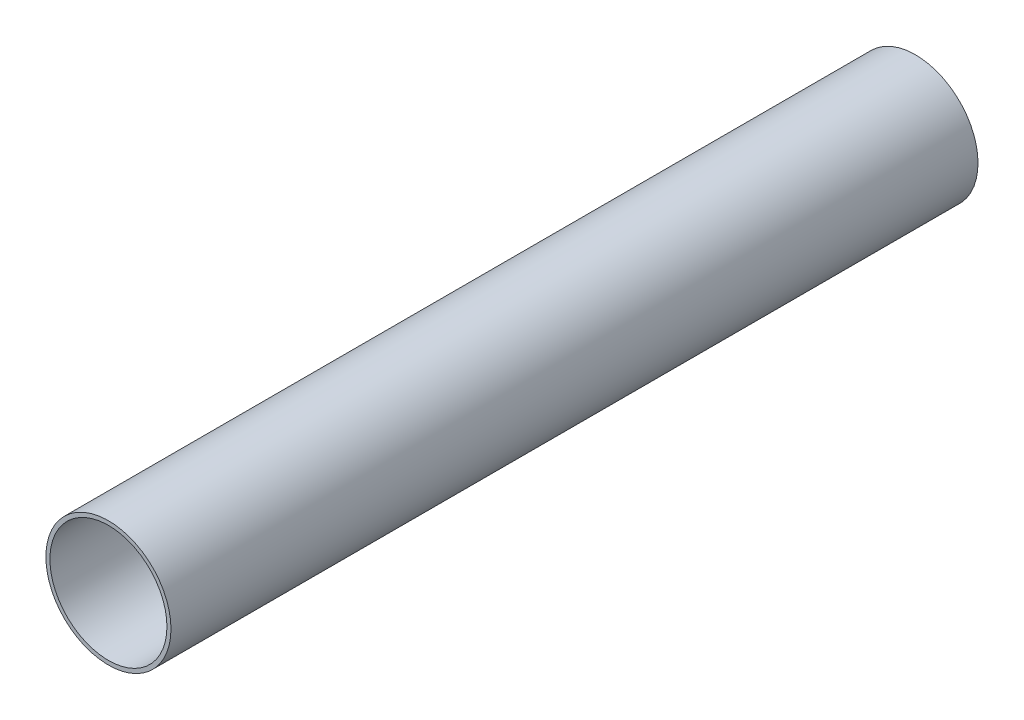
ISO-10303-21;
HEADER;
FILE_DESCRIPTION(('STEP AP214'),'2;1');
FILE_NAME('part.step','',(''),(''),'','','');
FILE_SCHEMA(('AUTOMOTIVE_DESIGN { 1 0 10303 214 1 1 1 1 }'));
ENDSEC;
DATA;
#1=APPLICATION_CONTEXT('core data for automotive mechanical design processes');
#2=APPLICATION_PROTOCOL_DEFINITION('international standard','automotive_design',2000,#1);
#3=PRODUCT_CONTEXT('',#1,'mechanical');
#4=PRODUCT('Part','Part','',(#3));
#5=PRODUCT_RELATED_PRODUCT_CATEGORY('part','',(#4));
#6=PRODUCT_DEFINITION_FORMATION('','',#4);
#7=PRODUCT_DEFINITION_CONTEXT('part definition',#1,'design');
#8=PRODUCT_DEFINITION('design','',#6,#7);
#9=PRODUCT_DEFINITION_SHAPE('','',#8);
#10=(LENGTH_UNIT() NAMED_UNIT(*) SI_UNIT(.MILLI.,.METRE.));
#11=(NAMED_UNIT(*) PLANE_ANGLE_UNIT() SI_UNIT($,.RADIAN.));
#12=(NAMED_UNIT(*) SI_UNIT($,.STERADIAN.) SOLID_ANGLE_UNIT());
#13=UNCERTAINTY_MEASURE_WITH_UNIT(LENGTH_MEASURE(1.E-05),#10,'distance_accuracy_value','');
#14=(GEOMETRIC_REPRESENTATION_CONTEXT(3) GLOBAL_UNCERTAINTY_ASSIGNED_CONTEXT((#13)) GLOBAL_UNIT_ASSIGNED_CONTEXT((#10,
#11,#12)) REPRESENTATION_CONTEXT('',''));
#15=CARTESIAN_POINT('',(0.,0.,0.));
#16=DIRECTION('',(0.,0.,1.));
#17=DIRECTION('',(1.,0.,0.));
#18=AXIS2_PLACEMENT_3D('',#15,#16,#17);
#19=CARTESIAN_POINT('',(-9.3290586289881,10.4951909576116,200.));
#20=DIRECTION('',(0.,0.,1.));
#21=DIRECTION('',(1.,0.,0.));
#22=AXIS2_PLACEMENT_3D('',#19,#20,#21);
#23=PLANE('',#22);
#24=CARTESIAN_POINT('',(-9.3290586289881,10.4951909576116,200.));
#25=DIRECTION('',(0.,0.,1.));
#26=DIRECTION('',(1.,0.,0.));
#27=AXIS2_PLACEMENT_3D('',#24,#25,#26);
#28=CIRCLE('',#27,15.5);
#29=CARTESIAN_POINT('',(6.1709413710119,10.4951909576116,200.));
#30=VERTEX_POINT('',#29);
#31=EDGE_CURVE('E10',#30,#30,#28,.T.);
#32=ORIENTED_EDGE('',*,*,#31,.T.);
#33=EDGE_LOOP('',(#32));
#34=FACE_BOUND('',#33,.T.);
#35=CARTESIAN_POINT('',(-9.3290586289881,10.4951909576116,200.));
#36=DIRECTION('',(0.,0.,1.));
#37=DIRECTION('',(1.,0.,0.));
#38=AXIS2_PLACEMENT_3D('',#35,#36,#37);
#39=CIRCLE('',#38,14.5);
#40=CARTESIAN_POINT('',(5.1709413710119,10.4951909576116,200.));
#41=VERTEX_POINT('',#40);
#42=EDGE_CURVE('E48',#41,#41,#39,.T.);
#43=ORIENTED_EDGE('',*,*,#42,.F.);
#44=EDGE_LOOP('',(#43));
#45=FACE_BOUND('',#44,.T.);
#46=ADVANCED_FACE('F37',(#34,#45),#23,.T.);
#47=CARTESIAN_POINT('',(-9.3290586289881,10.4951909576116,0.));
#48=DIRECTION('',(0.,0.,1.));
#49=DIRECTION('',(1.,0.,0.));
#50=AXIS2_PLACEMENT_3D('',#47,#48,#49);
#51=PLANE('',#50);
#52=CARTESIAN_POINT('',(-9.3290586289881,10.4951909576116,0.));
#53=DIRECTION('',(0.,0.,1.));
#54=DIRECTION('',(1.,0.,0.));
#55=AXIS2_PLACEMENT_3D('',#52,#53,#54);
#56=CIRCLE('',#55,15.5);
#57=CARTESIAN_POINT('',(6.1709413710119,10.4951909576116,0.));
#58=VERTEX_POINT('',#57);
#59=EDGE_CURVE('E41',#58,#58,#56,.T.);
#60=ORIENTED_EDGE('',*,*,#59,.F.);
#61=EDGE_LOOP('',(#60));
#62=FACE_BOUND('',#61,.T.);
#63=CARTESIAN_POINT('',(-9.3290586289881,10.4951909576116,0.));
#64=DIRECTION('',(0.,0.,1.));
#65=DIRECTION('',(1.,0.,0.));
#66=AXIS2_PLACEMENT_3D('',#63,#64,#65);
#67=CIRCLE('',#66,14.5);
#68=CARTESIAN_POINT('',(5.1709413710119,10.4951909576116,0.));
#69=VERTEX_POINT('',#68);
#70=EDGE_CURVE('E50',#69,#69,#67,.T.);
#71=ORIENTED_EDGE('',*,*,#70,.T.);
#72=EDGE_LOOP('',(#71));
#73=FACE_BOUND('',#72,.T.);
#74=ADVANCED_FACE('F60',(#62,#73),#51,.F.);
#75=CARTESIAN_POINT('',(-9.3290586289881,10.4951909576116,200.));
#76=DIRECTION('',(0.,0.,-1.));
#77=DIRECTION('',(-1.,0.,0.));
#78=AXIS2_PLACEMENT_3D('',#75,#76,#77);
#79=CYLINDRICAL_SURFACE('',#78,15.5);
#80=ORIENTED_EDGE('',*,*,#31,.F.);
#81=EDGE_LOOP('',(#80));
#82=FACE_BOUND('',#81,.T.);
#83=ORIENTED_EDGE('',*,*,#59,.T.);
#84=EDGE_LOOP('',(#83));
#85=FACE_BOUND('',#84,.T.);
#86=ADVANCED_FACE('F39',(#82,#85),#79,.T.);
#87=CARTESIAN_POINT('',(-9.3290586289881,10.4951909576116,200.));
#88=DIRECTION('',(0.,0.,-1.));
#89=DIRECTION('',(-1.,0.,0.));
#90=AXIS2_PLACEMENT_3D('',#87,#88,#89);
#91=CYLINDRICAL_SURFACE('',#90,14.5);
#92=ORIENTED_EDGE('',*,*,#42,.T.);
#93=EDGE_LOOP('',(#92));
#94=FACE_BOUND('',#93,.T.);
#95=ORIENTED_EDGE('',*,*,#70,.F.);
#96=EDGE_LOOP('',(#95));
#97=FACE_BOUND('',#96,.T.);
#98=ADVANCED_FACE('F56',(#94,#97),#91,.F.);
#99=CLOSED_SHELL('',(#46,#74,#86,#98));
#100=MANIFOLD_SOLID_BREP('B2',#99);
#101=ADVANCED_BREP_SHAPE_REPRESENTATION('',(#18,#100),#14);
#102=SHAPE_DEFINITION_REPRESENTATION(#9,#101);
ENDSEC;
END-ISO-10303-21;
